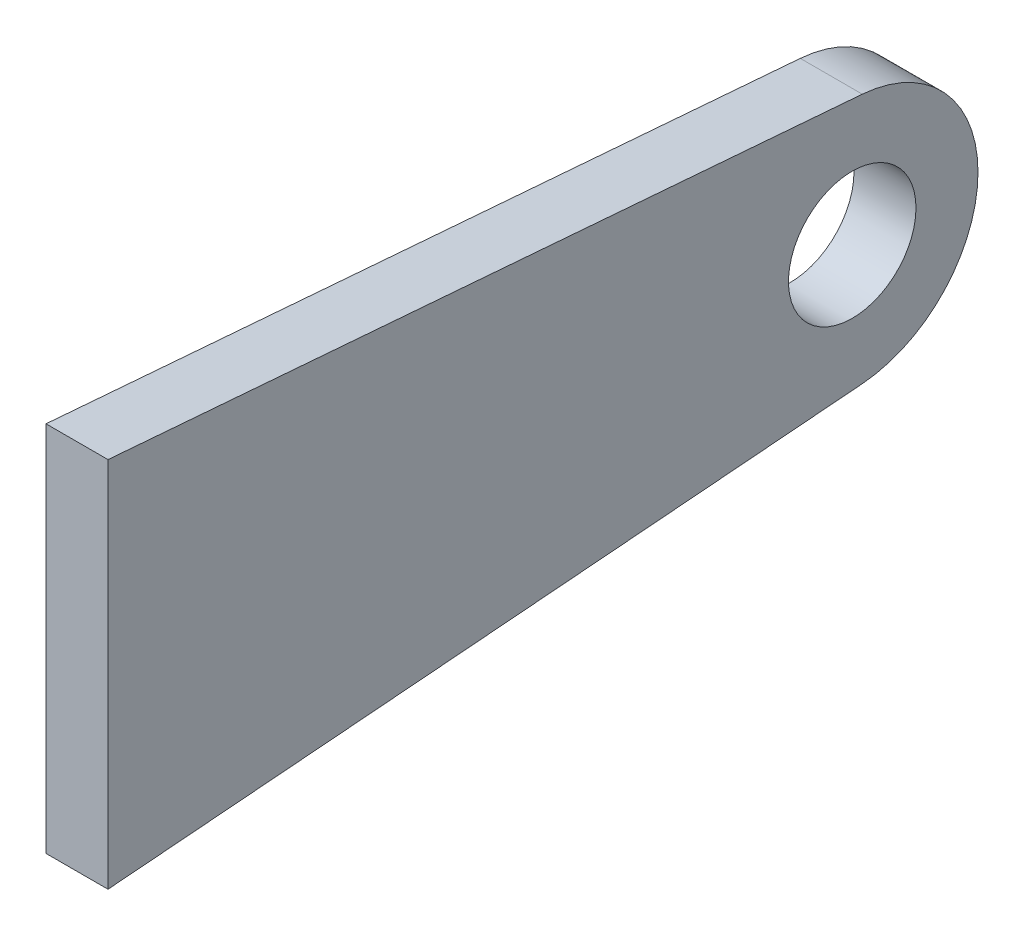
ISO-10303-21;
HEADER;
FILE_DESCRIPTION(('STEP AP214'),'2;1');
FILE_NAME('part.step','',(''),(''),'','','');
FILE_SCHEMA(('AUTOMOTIVE_DESIGN { 1 0 10303 214 1 1 1 1 }'));
ENDSEC;
DATA;
#1=APPLICATION_CONTEXT('core data for automotive mechanical design processes');
#2=APPLICATION_PROTOCOL_DEFINITION('international standard','automotive_design',2000,#1);
#3=PRODUCT_CONTEXT('',#1,'mechanical');
#4=PRODUCT('Part','Part','',(#3));
#5=PRODUCT_RELATED_PRODUCT_CATEGORY('part','',(#4));
#6=PRODUCT_DEFINITION_FORMATION('','',#4);
#7=PRODUCT_DEFINITION_CONTEXT('part definition',#1,'design');
#8=PRODUCT_DEFINITION('design','',#6,#7);
#9=PRODUCT_DEFINITION_SHAPE('','',#8);
#10=(LENGTH_UNIT() NAMED_UNIT(*) SI_UNIT(.MILLI.,.METRE.));
#11=(NAMED_UNIT(*) PLANE_ANGLE_UNIT() SI_UNIT($,.RADIAN.));
#12=(NAMED_UNIT(*) SI_UNIT($,.STERADIAN.) SOLID_ANGLE_UNIT());
#13=UNCERTAINTY_MEASURE_WITH_UNIT(LENGTH_MEASURE(1.E-05),#10,'distance_accuracy_value','');
#14=(GEOMETRIC_REPRESENTATION_CONTEXT(3) GLOBAL_UNCERTAINTY_ASSIGNED_CONTEXT((#13)) GLOBAL_UNIT_ASSIGNED_CONTEXT((#10,
#11,#12)) REPRESENTATION_CONTEXT('',''));
#15=CARTESIAN_POINT('',(0.,0.,0.));
#16=DIRECTION('',(0.,0.,1.));
#17=DIRECTION('',(1.,0.,0.));
#18=AXIS2_PLACEMENT_3D('',#15,#16,#17);
#19=CARTESIAN_POINT('',(1.5875,0.,0.));
#20=DIRECTION('',(1.,0.,0.));
#21=DIRECTION('',(0.,0.,-1.));
#22=AXIS2_PLACEMENT_3D('',#19,#20,#21);
#23=PLANE('',#22);
#24=DIRECTION('',(0.,0.0801948025201304,0.996779210080526));
#25=VECTOR('',#24,1.);
#26=CARTESIAN_POINT('',(1.5875,6.41816165578754,-0.516366313946867));
#27=LINE('',#26,#25);
#28=CARTESIAN_POINT('',(1.5875,6.41816165578752,-0.516366313946866));
#29=VERTEX_POINT('',#28);
#30=CARTESIAN_POINT('',(1.5875,9.52500000000001,38.1000000000001));
#31=VERTEX_POINT('',#30);
#32=EDGE_CURVE('E87',#29,#31,#27,.T.);
#33=ORIENTED_EDGE('',*,*,#32,.T.);
#34=DIRECTION('',(0.,-1.,0.));
#35=VECTOR('',#34,1.);
#36=CARTESIAN_POINT('',(1.5875,9.52500000000001,38.1000000000001));
#37=LINE('',#36,#35);
#38=CARTESIAN_POINT('',(1.5875,-9.52499999999999,38.1000000000001));
#39=VERTEX_POINT('',#38);
#40=EDGE_CURVE('E82',#31,#39,#37,.T.);
#41=ORIENTED_EDGE('',*,*,#40,.T.);
#42=DIRECTION('',(0.,0.0801948025201309,-0.996779210080526));
#43=VECTOR('',#42,1.);
#44=CARTESIAN_POINT('',(1.5875,-6.4181616557875,-0.516366313946871));
#45=LINE('',#44,#43);
#46=CARTESIAN_POINT('',(1.5875,-6.4181616557875,-0.516366313946871));
#47=VERTEX_POINT('',#46);
#48=EDGE_CURVE('E85',#39,#47,#45,.T.);
#49=ORIENTED_EDGE('',*,*,#48,.T.);
#50=CARTESIAN_POINT('',(1.5875,0.,0.));
#51=DIRECTION('',(1.,0.,0.));
#52=DIRECTION('',(0.,0.,-1.));
#53=AXIS2_PLACEMENT_3D('',#50,#51,#52);
#54=CIRCLE('',#53,6.43890000000002);
#55=EDGE_CURVE('E52',#47,#29,#54,.T.);
#56=ORIENTED_EDGE('',*,*,#55,.T.);
#57=EDGE_LOOP('',(#33,#41,#49,#56));
#58=FACE_BOUND('',#57,.T.);
#59=CARTESIAN_POINT('',(1.5875,0.,0.));
#60=DIRECTION('',(1.,0.,0.));
#61=DIRECTION('',(0.,0.,-1.));
#62=AXIS2_PLACEMENT_3D('',#59,#60,#61);
#63=CIRCLE('',#62,3.2639);
#64=CARTESIAN_POINT('',(1.5875,0.,-3.2639));
#65=VERTEX_POINT('',#64);
#66=EDGE_CURVE('E102',#65,#65,#63,.T.);
#67=ORIENTED_EDGE('',*,*,#66,.F.);
#68=EDGE_LOOP('',(#67));
#69=FACE_BOUND('',#68,.T.);
#70=ADVANCED_FACE('F35',(#58,#69),#23,.T.);
#71=CARTESIAN_POINT('',(-1.5875,0.,0.));
#72=DIRECTION('',(1.,0.,0.));
#73=DIRECTION('',(0.,0.,-1.));
#74=AXIS2_PLACEMENT_3D('',#71,#72,#73);
#75=PLANE('',#74);
#76=DIRECTION('',(0.,0.0801948025201304,0.996779210080526));
#77=VECTOR('',#76,1.);
#78=CARTESIAN_POINT('',(-1.5875,6.41816165578754,-0.516366313946867));
#79=LINE('',#78,#77);
#80=CARTESIAN_POINT('',(-1.5875,6.41816165578752,-0.516366313946866));
#81=VERTEX_POINT('',#80);
#82=CARTESIAN_POINT('',(-1.5875,9.52500000000001,38.1000000000001));
#83=VERTEX_POINT('',#82);
#84=EDGE_CURVE('E99',#81,#83,#79,.T.);
#85=ORIENTED_EDGE('',*,*,#84,.F.);
#86=CARTESIAN_POINT('',(-1.5875,0.,0.));
#87=DIRECTION('',(1.,0.,0.));
#88=DIRECTION('',(0.,0.,-1.));
#89=AXIS2_PLACEMENT_3D('',#86,#87,#88);
#90=CIRCLE('',#89,6.43890000000002);
#91=CARTESIAN_POINT('',(-1.5875,-6.4181616557875,-0.516366313946871));
#92=VERTEX_POINT('',#91);
#93=EDGE_CURVE('E75',#92,#81,#90,.T.);
#94=ORIENTED_EDGE('',*,*,#93,.F.);
#95=DIRECTION('',(0.,0.0801948025201309,-0.996779210080526));
#96=VECTOR('',#95,1.);
#97=CARTESIAN_POINT('',(-1.5875,-6.4181616557875,-0.516366313946871));
#98=LINE('',#97,#96);
#99=CARTESIAN_POINT('',(-1.5875,-9.52499999999999,38.1000000000001));
#100=VERTEX_POINT('',#99);
#101=EDGE_CURVE('E69',#100,#92,#98,.T.);
#102=ORIENTED_EDGE('',*,*,#101,.F.);
#103=DIRECTION('',(0.,-1.,0.));
#104=VECTOR('',#103,1.);
#105=CARTESIAN_POINT('',(-1.5875,9.52500000000001,38.1000000000001));
#106=LINE('',#105,#104);
#107=EDGE_CURVE('E91',#83,#100,#106,.T.);
#108=ORIENTED_EDGE('',*,*,#107,.F.);
#109=EDGE_LOOP('',(#85,#94,#102,#108));
#110=FACE_BOUND('',#109,.T.);
#111=CARTESIAN_POINT('',(-1.5875,0.,0.));
#112=DIRECTION('',(1.,0.,0.));
#113=DIRECTION('',(0.,0.,-1.));
#114=AXIS2_PLACEMENT_3D('',#111,#112,#113);
#115=CIRCLE('',#114,3.2639);
#116=CARTESIAN_POINT('',(-1.5875,0.,-3.2639));
#117=VERTEX_POINT('',#116);
#118=EDGE_CURVE('E114',#117,#117,#115,.T.);
#119=ORIENTED_EDGE('',*,*,#118,.T.);
#120=EDGE_LOOP('',(#119));
#121=FACE_BOUND('',#120,.T.);
#122=ADVANCED_FACE('F110',(#110,#121),#75,.F.);
#123=CARTESIAN_POINT('',(1.5875,6.41816165578754,-0.516366313946867));
#124=DIRECTION('',(0.,-0.996779210080526,0.0801948025201304));
#125=DIRECTION('',(0.,-0.0801948025201304,-0.996779210080526));
#126=AXIS2_PLACEMENT_3D('',#123,#124,#125);
#127=PLANE('',#126);
#128=ORIENTED_EDGE('',*,*,#84,.T.);
#129=DIRECTION('',(-1.,0.,0.));
#130=VECTOR('',#129,1.);
#131=CARTESIAN_POINT('',(1.5875,9.52500000000001,38.1000000000001));
#132=LINE('',#131,#130);
#133=EDGE_CURVE('E11',#31,#83,#132,.T.);
#134=ORIENTED_EDGE('',*,*,#133,.F.);
#135=ORIENTED_EDGE('',*,*,#32,.F.);
#136=DIRECTION('',(-1.,0.,0.));
#137=VECTOR('',#136,1.);
#138=CARTESIAN_POINT('',(1.5875,6.41816165578752,-0.516366313946866));
#139=LINE('',#138,#137);
#140=EDGE_CURVE('E95',#29,#81,#139,.T.);
#141=ORIENTED_EDGE('',*,*,#140,.T.);
#142=EDGE_LOOP('',(#128,#134,#135,#141));
#143=FACE_BOUND('',#142,.T.);
#144=ADVANCED_FACE('F37',(#143),#127,.F.);
#145=CARTESIAN_POINT('',(1.5875,9.52500000000001,38.1000000000001));
#146=DIRECTION('',(0.,0.,-1.));
#147=DIRECTION('',(0.,1.,0.));
#148=AXIS2_PLACEMENT_3D('',#145,#146,#147);
#149=PLANE('',#148);
#150=ORIENTED_EDGE('',*,*,#107,.T.);
#151=DIRECTION('',(-1.,0.,0.));
#152=VECTOR('',#151,1.);
#153=CARTESIAN_POINT('',(1.5875,-9.52499999999999,38.1000000000001));
#154=LINE('',#153,#152);
#155=EDGE_CURVE('E44',#39,#100,#154,.T.);
#156=ORIENTED_EDGE('',*,*,#155,.F.);
#157=ORIENTED_EDGE('',*,*,#40,.F.);
#158=ORIENTED_EDGE('',*,*,#133,.T.);
#159=EDGE_LOOP('',(#150,#156,#157,#158));
#160=FACE_BOUND('',#159,.T.);
#161=ADVANCED_FACE('F90',(#160),#149,.F.);
#162=CARTESIAN_POINT('',(1.5875,-6.4181616557875,-0.516366313946871));
#163=DIRECTION('',(0.,0.996779210080526,0.0801948025201309));
#164=DIRECTION('',(0.,-0.0801948025201309,0.996779210080526));
#165=AXIS2_PLACEMENT_3D('',#162,#163,#164);
#166=PLANE('',#165);
#167=ORIENTED_EDGE('',*,*,#101,.T.);
#168=DIRECTION('',(-1.,0.,0.));
#169=VECTOR('',#168,1.);
#170=CARTESIAN_POINT('',(1.5875,-6.4181616557875,-0.516366313946871));
#171=LINE('',#170,#169);
#172=EDGE_CURVE('E92',#47,#92,#171,.T.);
#173=ORIENTED_EDGE('',*,*,#172,.F.);
#174=ORIENTED_EDGE('',*,*,#48,.F.);
#175=ORIENTED_EDGE('',*,*,#155,.T.);
#176=EDGE_LOOP('',(#167,#173,#174,#175));
#177=FACE_BOUND('',#176,.T.);
#178=ADVANCED_FACE('F93',(#177),#166,.F.);
#179=CARTESIAN_POINT('',(1.5875,0.,0.));
#180=DIRECTION('',(-1.,0.,0.));
#181=DIRECTION('',(0.,0.,1.));
#182=AXIS2_PLACEMENT_3D('',#179,#180,#181);
#183=CYLINDRICAL_SURFACE('',#182,6.43890000000002);
#184=ORIENTED_EDGE('',*,*,#93,.T.);
#185=ORIENTED_EDGE('',*,*,#140,.F.);
#186=ORIENTED_EDGE('',*,*,#55,.F.);
#187=ORIENTED_EDGE('',*,*,#172,.T.);
#188=EDGE_LOOP('',(#184,#185,#186,#187));
#189=FACE_BOUND('',#188,.T.);
#190=ADVANCED_FACE('F107',(#189),#183,.T.);
#191=CARTESIAN_POINT('',(1.5875,0.,0.));
#192=DIRECTION('',(-1.,0.,0.));
#193=DIRECTION('',(0.,0.,1.));
#194=AXIS2_PLACEMENT_3D('',#191,#192,#193);
#195=CYLINDRICAL_SURFACE('',#194,3.2639);
#196=ORIENTED_EDGE('',*,*,#66,.T.);
#197=EDGE_LOOP('',(#196));
#198=FACE_BOUND('',#197,.T.);
#199=ORIENTED_EDGE('',*,*,#118,.F.);
#200=EDGE_LOOP('',(#199));
#201=FACE_BOUND('',#200,.T.);
#202=ADVANCED_FACE('F120',(#198,#201),#195,.F.);
#203=CLOSED_SHELL('',(#70,#122,#144,#161,#178,#190,#202));
#204=MANIFOLD_SOLID_BREP('B2',#203);
#205=ADVANCED_BREP_SHAPE_REPRESENTATION('',(#18,#204),#14);
#206=SHAPE_DEFINITION_REPRESENTATION(#9,#205);
ENDSEC;
END-ISO-10303-21;
